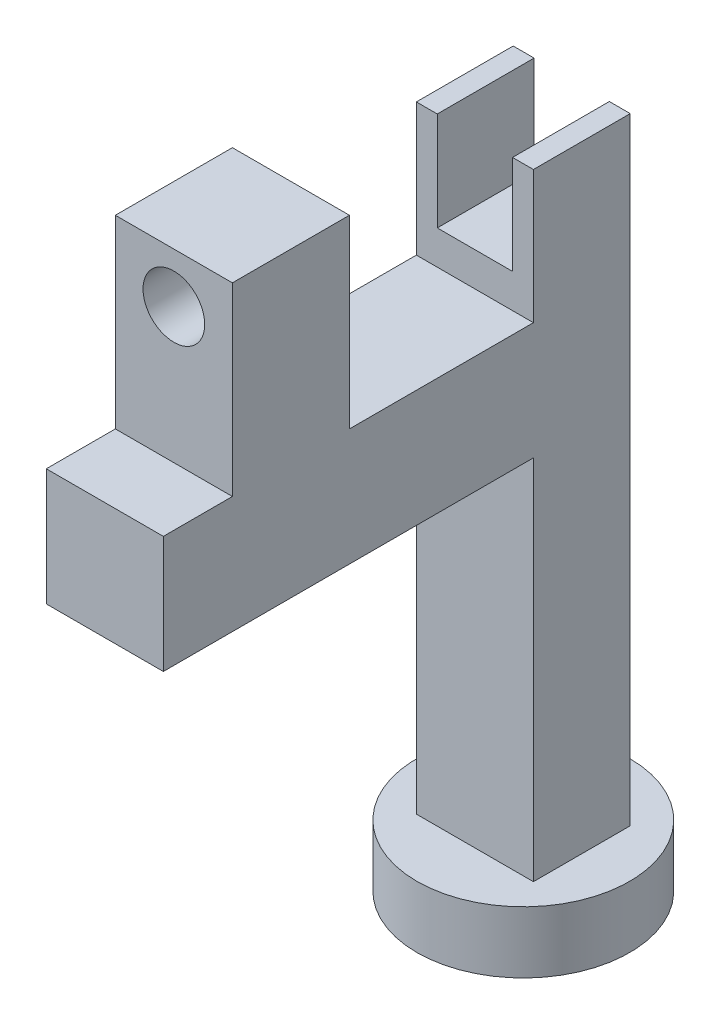
ISO-10303-21;
HEADER;
FILE_DESCRIPTION(('STEP AP214'),'2;1');
FILE_NAME('part.step','',(''),(''),'','','');
FILE_SCHEMA(('AUTOMOTIVE_DESIGN { 1 0 10303 214 1 1 1 1 }'));
ENDSEC;
DATA;
#1=APPLICATION_CONTEXT('core data for automotive mechanical design processes');
#2=APPLICATION_PROTOCOL_DEFINITION('international standard','automotive_design',2000,#1);
#3=PRODUCT_CONTEXT('',#1,'mechanical');
#4=PRODUCT('Part','Part','',(#3));
#5=PRODUCT_RELATED_PRODUCT_CATEGORY('part','',(#4));
#6=PRODUCT_DEFINITION_FORMATION('','',#4);
#7=PRODUCT_DEFINITION_CONTEXT('part definition',#1,'design');
#8=PRODUCT_DEFINITION('design','',#6,#7);
#9=PRODUCT_DEFINITION_SHAPE('','',#8);
#10=(LENGTH_UNIT() NAMED_UNIT(*) SI_UNIT(.MILLI.,.METRE.));
#11=(NAMED_UNIT(*) PLANE_ANGLE_UNIT() SI_UNIT($,.RADIAN.));
#12=(NAMED_UNIT(*) SI_UNIT($,.STERADIAN.) SOLID_ANGLE_UNIT());
#13=UNCERTAINTY_MEASURE_WITH_UNIT(LENGTH_MEASURE(1.E-05),#10,'distance_accuracy_value','');
#14=(GEOMETRIC_REPRESENTATION_CONTEXT(3) GLOBAL_UNCERTAINTY_ASSIGNED_CONTEXT((#13)) GLOBAL_UNIT_ASSIGNED_CONTEXT((#10,
#11,#12)) REPRESENTATION_CONTEXT('',''));
#15=CARTESIAN_POINT('',(0.,0.,0.));
#16=DIRECTION('',(0.,0.,1.));
#17=DIRECTION('',(1.,0.,0.));
#18=AXIS2_PLACEMENT_3D('',#15,#16,#17);
#19=CARTESIAN_POINT('',(0.,-21.5111111111111,75.7));
#20=DIRECTION('',(0.,-1.,0.));
#21=DIRECTION('',(1.,0.,0.));
#22=AXIS2_PLACEMENT_3D('',#19,#20,#21);
#23=PLANE('',#22);
#24=DIRECTION('',(1.,0.,0.));
#25=VECTOR('',#24,1.);
#26=CARTESIAN_POINT('',(0.,-21.5111111111111,64.5047607290041));
#27=LINE('',#26,#25);
#28=CARTESIAN_POINT('',(-18.9777777777777,-21.5111111111111,64.5047607290041));
#29=VERTEX_POINT('',#28);
#30=CARTESIAN_POINT('',(0.,-21.5111111111111,64.5047607290041));
#31=VERTEX_POINT('',#30);
#32=EDGE_CURVE('E315',#29,#31,#27,.T.);
#33=ORIENTED_EDGE('',*,*,#32,.F.);
#34=DIRECTION('',(0.,0.,-1.));
#35=VECTOR('',#34,1.);
#36=CARTESIAN_POINT('',(-18.9777777777777,-21.5111111111111,75.7));
#37=LINE('',#36,#35);
#38=CARTESIAN_POINT('',(-18.9777777777777,-21.5111111111111,75.7));
#39=VERTEX_POINT('',#38);
#40=EDGE_CURVE('E172',#39,#29,#37,.T.);
#41=ORIENTED_EDGE('',*,*,#40,.F.);
#42=DIRECTION('',(-1.,0.,0.));
#43=VECTOR('',#42,1.);
#44=CARTESIAN_POINT('',(0.,-21.5111111111111,75.7));
#45=LINE('',#44,#43);
#46=CARTESIAN_POINT('',(0.,-21.5111111111111,75.7));
#47=VERTEX_POINT('',#46);
#48=EDGE_CURVE('E189',#47,#39,#45,.T.);
#49=ORIENTED_EDGE('',*,*,#48,.F.);
#50=DIRECTION('',(0.,0.,-1.));
#51=VECTOR('',#50,1.);
#52=CARTESIAN_POINT('',(0.,-21.5111111111111,75.7));
#53=LINE('',#52,#51);
#54=EDGE_CURVE('E56',#47,#31,#53,.T.);
#55=ORIENTED_EDGE('',*,*,#54,.T.);
#56=EDGE_LOOP('',(#33,#41,#49,#55));
#57=FACE_BOUND('',#56,.T.);
#58=ADVANCED_FACE('F33',(#57),#23,.F.);
#59=DIRECTION('',(-1.,0.,0.));
#60=VECTOR('',#59,1.);
#61=CARTESIAN_POINT('',(0.,-21.5111111111111,45.5269829512264));
#62=LINE('',#61,#60);
#63=CARTESIAN_POINT('',(0.,-21.5111111111111,45.5269829512264));
#64=VERTEX_POINT('',#63);
#65=CARTESIAN_POINT('',(-18.9777777777777,-21.5111111111111,45.5269829512264));
#66=VERTEX_POINT('',#65);
#67=EDGE_CURVE('E48',#64,#66,#62,.T.);
#68=ORIENTED_EDGE('',*,*,#67,.F.);
#69=CARTESIAN_POINT('',(0.,-21.5111111111111,15.7));
#70=VERTEX_POINT('',#69);
#71=EDGE_CURVE('E195',#64,#70,#53,.T.);
#72=ORIENTED_EDGE('',*,*,#71,.T.);
#73=DIRECTION('',(-1.,0.,0.));
#74=VECTOR('',#73,1.);
#75=CARTESIAN_POINT('',(0.,-21.5111111111111,15.7));
#76=LINE('',#75,#74);
#77=CARTESIAN_POINT('',(-18.9777777777777,-21.5111111111111,15.7));
#78=VERTEX_POINT('',#77);
#79=EDGE_CURVE('E176',#70,#78,#76,.T.);
#80=ORIENTED_EDGE('',*,*,#79,.T.);
#81=EDGE_CURVE('E190',#66,#78,#37,.T.);
#82=ORIENTED_EDGE('',*,*,#81,.F.);
#83=EDGE_LOOP('',(#68,#72,#80,#82));
#84=FACE_BOUND('',#83,.T.);
#85=ADVANCED_FACE('F310',(#84),#23,.F.);
#86=CARTESIAN_POINT('',(0.,0.,15.7));
#87=DIRECTION('',(0.,0.,-1.));
#88=DIRECTION('',(-1.,0.,0.));
#89=AXIS2_PLACEMENT_3D('',#86,#87,#88);
#90=PLANE('',#89);
#91=DIRECTION('',(1.,0.,0.));
#92=VECTOR('',#91,1.);
#93=CARTESIAN_POINT('',(0.,-40.4888888888889,15.7));
#94=LINE('',#93,#92);
#95=CARTESIAN_POINT('',(-18.9777777777777,-40.4888888888889,15.7));
#96=VERTEX_POINT('',#95);
#97=CARTESIAN_POINT('',(0.,-40.4888888888889,15.7));
#98=VERTEX_POINT('',#97);
#99=EDGE_CURVE('E173',#96,#98,#94,.T.);
#100=ORIENTED_EDGE('',*,*,#99,.F.);
#101=DIRECTION('',(0.,-1.,0.));
#102=VECTOR('',#101,1.);
#103=CARTESIAN_POINT('',(-18.9777777777777,-100.,15.7));
#104=LINE('',#103,#102);
#105=CARTESIAN_POINT('',(-18.9777777777777,-100.,15.7));
#106=VERTEX_POINT('',#105);
#107=EDGE_CURVE('E228',#96,#106,#104,.T.);
#108=ORIENTED_EDGE('',*,*,#107,.T.);
#109=DIRECTION('',(1.,0.,0.));
#110=VECTOR('',#109,1.);
#111=CARTESIAN_POINT('',(0.,-100.,15.7));
#112=LINE('',#111,#110);
#113=CARTESIAN_POINT('',(0.,-100.,15.7));
#114=VERTEX_POINT('',#113);
#115=EDGE_CURVE('E232',#106,#114,#112,.T.);
#116=ORIENTED_EDGE('',*,*,#115,.T.);
#117=DIRECTION('',(0.,1.,0.));
#118=VECTOR('',#117,1.);
#119=CARTESIAN_POINT('',(0.,0.,15.7));
#120=LINE('',#119,#118);
#121=EDGE_CURVE('E235',#114,#98,#120,.T.);
#122=ORIENTED_EDGE('',*,*,#121,.T.);
#123=EDGE_LOOP('',(#100,#108,#116,#122));
#124=FACE_BOUND('',#123,.T.);
#125=ADVANCED_FACE('F348',(#124),#90,.F.);
#126=ORIENTED_EDGE('',*,*,#79,.F.);
#127=CARTESIAN_POINT('',(0.,0.,15.7));
#128=VERTEX_POINT('',#127);
#129=EDGE_CURVE('E234',#70,#128,#120,.T.);
#130=ORIENTED_EDGE('',*,*,#129,.T.);
#131=DIRECTION('',(-1.,0.,0.));
#132=VECTOR('',#131,1.);
#133=CARTESIAN_POINT('',(-3.38888888888887,0.,15.7));
#134=LINE('',#133,#132);
#135=CARTESIAN_POINT('',(-3.38888888888887,0.,15.7));
#136=VERTEX_POINT('',#135);
#137=EDGE_CURVE('E216',#128,#136,#134,.T.);
#138=ORIENTED_EDGE('',*,*,#137,.T.);
#139=DIRECTION('',(0.,-1.,0.));
#140=VECTOR('',#139,1.);
#141=CARTESIAN_POINT('',(-3.38888888888887,-16.,15.7));
#142=LINE('',#141,#140);
#143=CARTESIAN_POINT('',(-3.38888888888887,-16.,15.7));
#144=VERTEX_POINT('',#143);
#145=EDGE_CURVE('E219',#136,#144,#142,.T.);
#146=ORIENTED_EDGE('',*,*,#145,.T.);
#147=DIRECTION('',(-1.,0.,0.));
#148=VECTOR('',#147,1.);
#149=CARTESIAN_POINT('',(-15.5888888888889,-16.,15.7));
#150=LINE('',#149,#148);
#151=CARTESIAN_POINT('',(-15.5888888888889,-16.,15.7));
#152=VERTEX_POINT('',#151);
#153=EDGE_CURVE('E222',#144,#152,#150,.T.);
#154=ORIENTED_EDGE('',*,*,#153,.T.);
#155=DIRECTION('',(0.,1.,0.));
#156=VECTOR('',#155,1.);
#157=CARTESIAN_POINT('',(-15.5888888888889,0.,15.7));
#158=LINE('',#157,#156);
#159=CARTESIAN_POINT('',(-15.5888888888889,0.,15.7));
#160=VERTEX_POINT('',#159);
#161=EDGE_CURVE('E224',#152,#160,#158,.T.);
#162=ORIENTED_EDGE('',*,*,#161,.T.);
#163=DIRECTION('',(-1.,0.,0.));
#164=VECTOR('',#163,1.);
#165=CARTESIAN_POINT('',(-18.9777777777777,0.,15.7));
#166=LINE('',#165,#164);
#167=CARTESIAN_POINT('',(-18.9777777777777,0.,15.7));
#168=VERTEX_POINT('',#167);
#169=EDGE_CURVE('E226',#160,#168,#166,.T.);
#170=ORIENTED_EDGE('',*,*,#169,.T.);
#171=EDGE_CURVE('E229',#168,#78,#104,.T.);
#172=ORIENTED_EDGE('',*,*,#171,.T.);
#173=EDGE_LOOP('',(#126,#130,#138,#146,#154,#162,#170,#172));
#174=FACE_BOUND('',#173,.T.);
#175=ADVANCED_FACE('F294',(#174),#90,.F.);
#176=CARTESIAN_POINT('',(-3.38888888888887,0.,15.7));
#177=DIRECTION('',(0.,-1.,0.));
#178=DIRECTION('',(0.,0.,-1.));
#179=AXIS2_PLACEMENT_3D('',#176,#177,#178);
#180=PLANE('',#179);
#181=DIRECTION('',(-1.,0.,0.));
#182=VECTOR('',#181,1.);
#183=CARTESIAN_POINT('',(-3.38888888888887,0.,0.));
#184=LINE('',#183,#182);
#185=CARTESIAN_POINT('',(0.,0.,0.));
#186=VERTEX_POINT('',#185);
#187=CARTESIAN_POINT('',(-3.38888888888887,0.,0.));
#188=VERTEX_POINT('',#187);
#189=EDGE_CURVE('E213',#186,#188,#184,.T.);
#190=ORIENTED_EDGE('',*,*,#189,.T.);
#191=DIRECTION('',(0.,0.,-1.));
#192=VECTOR('',#191,1.);
#193=CARTESIAN_POINT('',(-3.38888888888887,0.,15.7));
#194=LINE('',#193,#192);
#195=EDGE_CURVE('E11',#136,#188,#194,.T.);
#196=ORIENTED_EDGE('',*,*,#195,.F.);
#197=ORIENTED_EDGE('',*,*,#137,.F.);
#198=DIRECTION('',(0.,0.,-1.));
#199=VECTOR('',#198,1.);
#200=CARTESIAN_POINT('',(0.,0.,15.7));
#201=LINE('',#200,#199);
#202=EDGE_CURVE('E237',#128,#186,#201,.T.);
#203=ORIENTED_EDGE('',*,*,#202,.T.);
#204=EDGE_LOOP('',(#190,#196,#197,#203));
#205=FACE_BOUND('',#204,.T.);
#206=ADVANCED_FACE('F35',(#205),#180,.F.);
#207=CARTESIAN_POINT('',(-3.38888888888887,-16.,15.7));
#208=DIRECTION('',(1.,0.,0.));
#209=DIRECTION('',(0.,1.,0.));
#210=AXIS2_PLACEMENT_3D('',#207,#208,#209);
#211=PLANE('',#210);
#212=DIRECTION('',(0.,-1.,0.));
#213=VECTOR('',#212,1.);
#214=CARTESIAN_POINT('',(-3.38888888888887,-16.,0.));
#215=LINE('',#214,#213);
#216=CARTESIAN_POINT('',(-3.38888888888887,-16.,0.));
#217=VERTEX_POINT('',#216);
#218=EDGE_CURVE('E240',#188,#217,#215,.T.);
#219=ORIENTED_EDGE('',*,*,#218,.T.);
#220=DIRECTION('',(0.,0.,-1.));
#221=VECTOR('',#220,1.);
#222=CARTESIAN_POINT('',(-3.38888888888887,-16.,15.7));
#223=LINE('',#222,#221);
#224=EDGE_CURVE('E41',#144,#217,#223,.T.);
#225=ORIENTED_EDGE('',*,*,#224,.F.);
#226=ORIENTED_EDGE('',*,*,#145,.F.);
#227=ORIENTED_EDGE('',*,*,#195,.T.);
#228=EDGE_LOOP('',(#219,#225,#226,#227));
#229=FACE_BOUND('',#228,.T.);
#230=ADVANCED_FACE('F297',(#229),#211,.F.);
#231=CARTESIAN_POINT('',(-15.5888888888889,-16.,15.7));
#232=DIRECTION('',(0.,-1.,0.));
#233=DIRECTION('',(0.,0.,-1.));
#234=AXIS2_PLACEMENT_3D('',#231,#232,#233);
#235=PLANE('',#234);
#236=DIRECTION('',(-1.,0.,0.));
#237=VECTOR('',#236,1.);
#238=CARTESIAN_POINT('',(-15.5888888888889,-16.,0.));
#239=LINE('',#238,#237);
#240=CARTESIAN_POINT('',(-15.5888888888889,-16.,0.));
#241=VERTEX_POINT('',#240);
#242=EDGE_CURVE('E242',#217,#241,#239,.T.);
#243=ORIENTED_EDGE('',*,*,#242,.T.);
#244=DIRECTION('',(0.,0.,-1.));
#245=VECTOR('',#244,1.);
#246=CARTESIAN_POINT('',(-15.5888888888889,-16.,15.7));
#247=LINE('',#246,#245);
#248=EDGE_CURVE('E267',#152,#241,#247,.T.);
#249=ORIENTED_EDGE('',*,*,#248,.F.);
#250=ORIENTED_EDGE('',*,*,#153,.F.);
#251=ORIENTED_EDGE('',*,*,#224,.T.);
#252=EDGE_LOOP('',(#243,#249,#250,#251));
#253=FACE_BOUND('',#252,.T.);
#254=ADVANCED_FACE('F274',(#253),#235,.F.);
#255=CARTESIAN_POINT('',(-15.5888888888889,0.,15.7));
#256=DIRECTION('',(-1.,0.,0.));
#257=DIRECTION('',(0.,0.,1.));
#258=AXIS2_PLACEMENT_3D('',#255,#256,#257);
#259=PLANE('',#258);
#260=DIRECTION('',(0.,1.,0.));
#261=VECTOR('',#260,1.);
#262=CARTESIAN_POINT('',(-15.5888888888889,0.,0.));
#263=LINE('',#262,#261);
#264=CARTESIAN_POINT('',(-15.5888888888889,0.,0.));
#265=VERTEX_POINT('',#264);
#266=EDGE_CURVE('E244',#241,#265,#263,.T.);
#267=ORIENTED_EDGE('',*,*,#266,.T.);
#268=DIRECTION('',(0.,0.,-1.));
#269=VECTOR('',#268,1.);
#270=CARTESIAN_POINT('',(-15.5888888888889,0.,15.7));
#271=LINE('',#270,#269);
#272=EDGE_CURVE('E264',#160,#265,#271,.T.);
#273=ORIENTED_EDGE('',*,*,#272,.F.);
#274=ORIENTED_EDGE('',*,*,#161,.F.);
#275=ORIENTED_EDGE('',*,*,#248,.T.);
#276=EDGE_LOOP('',(#267,#273,#274,#275));
#277=FACE_BOUND('',#276,.T.);
#278=ADVANCED_FACE('F285',(#277),#259,.F.);
#279=CARTESIAN_POINT('',(-18.9777777777777,0.,15.7));
#280=DIRECTION('',(0.,-1.,0.));
#281=DIRECTION('',(0.,0.,-1.));
#282=AXIS2_PLACEMENT_3D('',#279,#280,#281);
#283=PLANE('',#282);
#284=DIRECTION('',(-1.,0.,0.));
#285=VECTOR('',#284,1.);
#286=CARTESIAN_POINT('',(-18.9777777777777,0.,0.));
#287=LINE('',#286,#285);
#288=CARTESIAN_POINT('',(-18.9777777777777,0.,0.));
#289=VERTEX_POINT('',#288);
#290=EDGE_CURVE('E246',#265,#289,#287,.T.);
#291=ORIENTED_EDGE('',*,*,#290,.T.);
#292=DIRECTION('',(0.,0.,-1.));
#293=VECTOR('',#292,1.);
#294=CARTESIAN_POINT('',(-18.9777777777777,0.,15.7));
#295=LINE('',#294,#293);
#296=EDGE_CURVE('E261',#168,#289,#295,.T.);
#297=ORIENTED_EDGE('',*,*,#296,.F.);
#298=ORIENTED_EDGE('',*,*,#169,.F.);
#299=ORIENTED_EDGE('',*,*,#272,.T.);
#300=EDGE_LOOP('',(#291,#297,#298,#299));
#301=FACE_BOUND('',#300,.T.);
#302=ADVANCED_FACE('F289',(#301),#283,.F.);
#303=CARTESIAN_POINT('',(-18.9777777777777,-100.,15.7));
#304=DIRECTION('',(1.,0.,0.));
#305=DIRECTION('',(0.,0.,-1.));
#306=AXIS2_PLACEMENT_3D('',#303,#304,#305);
#307=PLANE('',#306);
#308=DIRECTION('',(0.,-1.,0.));
#309=VECTOR('',#308,1.);
#310=CARTESIAN_POINT('',(-18.9777777777777,-100.,0.));
#311=LINE('',#310,#309);
#312=CARTESIAN_POINT('',(-18.9777777777777,-100.,0.));
#313=VERTEX_POINT('',#312);
#314=EDGE_CURVE('E248',#289,#313,#311,.T.);
#315=ORIENTED_EDGE('',*,*,#314,.T.);
#316=DIRECTION('',(0.,0.,-1.));
#317=VECTOR('',#316,1.);
#318=CARTESIAN_POINT('',(-18.9777777777777,-100.,15.7));
#319=LINE('',#318,#317);
#320=EDGE_CURVE('E258',#106,#313,#319,.T.);
#321=ORIENTED_EDGE('',*,*,#320,.F.);
#322=ORIENTED_EDGE('',*,*,#107,.F.);
#323=DIRECTION('',(0.,0.,-1.));
#324=VECTOR('',#323,1.);
#325=CARTESIAN_POINT('',(-18.9777777777777,-40.4888888888889,75.7));
#326=LINE('',#325,#324);
#327=CARTESIAN_POINT('',(-18.9777777777777,-40.4888888888889,75.7));
#328=VERTEX_POINT('',#327);
#329=EDGE_CURVE('E200',#328,#96,#326,.T.);
#330=ORIENTED_EDGE('',*,*,#329,.F.);
#331=DIRECTION('',(0.,-1.,0.));
#332=VECTOR('',#331,1.);
#333=CARTESIAN_POINT('',(-18.9777777777777,-21.5111111111111,75.7));
#334=LINE('',#333,#332);
#335=EDGE_CURVE('E182',#39,#328,#334,.T.);
#336=ORIENTED_EDGE('',*,*,#335,.F.);
#337=ORIENTED_EDGE('',*,*,#40,.T.);
#338=DIRECTION('',(0.,-1.,0.));
#339=VECTOR('',#338,1.);
#340=CARTESIAN_POINT('',(-18.9777777777777,8.48888888888887,64.5047607290041));
#341=LINE('',#340,#339);
#342=CARTESIAN_POINT('',(-18.9777777777777,8.48888888888887,64.5047607290041));
#343=VERTEX_POINT('',#342);
#344=EDGE_CURVE('E151',#343,#29,#341,.T.);
#345=ORIENTED_EDGE('',*,*,#344,.F.);
#346=DIRECTION('',(0.,0.,1.));
#347=VECTOR('',#346,1.);
#348=CARTESIAN_POINT('',(-18.9777777777777,8.48888888888887,64.5047607290041));
#349=LINE('',#348,#347);
#350=CARTESIAN_POINT('',(-18.9777777777777,8.48888888888887,45.5269829512264));
#351=VERTEX_POINT('',#350);
#352=EDGE_CURVE('E157',#351,#343,#349,.T.);
#353=ORIENTED_EDGE('',*,*,#352,.F.);
#354=DIRECTION('',(0.,-1.,0.));
#355=VECTOR('',#354,1.);
#356=CARTESIAN_POINT('',(-18.9777777777777,8.48888888888887,45.5269829512264));
#357=LINE('',#356,#355);
#358=EDGE_CURVE('E309',#351,#66,#357,.T.);
#359=ORIENTED_EDGE('',*,*,#358,.T.);
#360=ORIENTED_EDGE('',*,*,#81,.T.);
#361=ORIENTED_EDGE('',*,*,#171,.F.);
#362=ORIENTED_EDGE('',*,*,#296,.T.);
#363=EDGE_LOOP('',(#315,#321,#322,#330,#336,#337,#345,#353,#359,#360,#361,#362));
#364=FACE_BOUND('',#363,.T.);
#365=ADVANCED_FACE('F169',(#364),#307,.F.);
#366=CARTESIAN_POINT('',(0.,0.,15.7));
#367=DIRECTION('',(-1.,0.,0.));
#368=DIRECTION('',(0.,-1.,0.));
#369=AXIS2_PLACEMENT_3D('',#366,#367,#368);
#370=PLANE('',#369);
#371=DIRECTION('',(0.,1.,0.));
#372=VECTOR('',#371,1.);
#373=CARTESIAN_POINT('',(0.,0.,0.));
#374=LINE('',#373,#372);
#375=CARTESIAN_POINT('',(0.,-100.,0.));
#376=VERTEX_POINT('',#375);
#377=EDGE_CURVE('E220',#376,#186,#374,.T.);
#378=ORIENTED_EDGE('',*,*,#377,.T.);
#379=ORIENTED_EDGE('',*,*,#202,.F.);
#380=ORIENTED_EDGE('',*,*,#129,.F.);
#381=ORIENTED_EDGE('',*,*,#71,.F.);
#382=DIRECTION('',(0.,-1.,0.));
#383=VECTOR('',#382,1.);
#384=CARTESIAN_POINT('',(0.,8.48888888888887,45.5269829512264));
#385=LINE('',#384,#383);
#386=CARTESIAN_POINT('',(0.,8.48888888888887,45.5269829512264));
#387=VERTEX_POINT('',#386);
#388=EDGE_CURVE('E178',#387,#64,#385,.T.);
#389=ORIENTED_EDGE('',*,*,#388,.F.);
#390=DIRECTION('',(0.,0.,-1.));
#391=VECTOR('',#390,1.);
#392=CARTESIAN_POINT('',(0.,8.48888888888887,64.5047607290041));
#393=LINE('',#392,#391);
#394=CARTESIAN_POINT('',(0.,8.48888888888887,64.5047607290041));
#395=VERTEX_POINT('',#394);
#396=EDGE_CURVE('E156',#395,#387,#393,.T.);
#397=ORIENTED_EDGE('',*,*,#396,.F.);
#398=DIRECTION('',(0.,-1.,0.));
#399=VECTOR('',#398,1.);
#400=CARTESIAN_POINT('',(0.,8.48888888888887,64.5047607290041));
#401=LINE('',#400,#399);
#402=EDGE_CURVE('E153',#395,#31,#401,.T.);
#403=ORIENTED_EDGE('',*,*,#402,.T.);
#404=ORIENTED_EDGE('',*,*,#54,.F.);
#405=DIRECTION('',(0.,1.,0.));
#406=VECTOR('',#405,1.);
#407=CARTESIAN_POINT('',(0.,-21.5111111111111,75.7));
#408=LINE('',#407,#406);
#409=CARTESIAN_POINT('',(0.,-40.4888888888889,75.7));
#410=VERTEX_POINT('',#409);
#411=EDGE_CURVE('E187',#410,#47,#408,.T.);
#412=ORIENTED_EDGE('',*,*,#411,.F.);
#413=DIRECTION('',(0.,0.,-1.));
#414=VECTOR('',#413,1.);
#415=CARTESIAN_POINT('',(0.,-40.4888888888889,75.7));
#416=LINE('',#415,#414);
#417=EDGE_CURVE('E197',#410,#98,#416,.T.);
#418=ORIENTED_EDGE('',*,*,#417,.T.);
#419=ORIENTED_EDGE('',*,*,#121,.F.);
#420=DIRECTION('',(0.,0.,-1.));
#421=VECTOR('',#420,1.);
#422=CARTESIAN_POINT('',(0.,-100.,15.7));
#423=LINE('',#422,#421);
#424=EDGE_CURVE('E256',#114,#376,#423,.T.);
#425=ORIENTED_EDGE('',*,*,#424,.T.);
#426=EDGE_LOOP('',(#378,#379,#380,#381,#389,#397,#403,#404,#412,#418,#419,#425));
#427=FACE_BOUND('',#426,.T.);
#428=ADVANCED_FACE('F379',(#427),#370,.F.);
#429=CARTESIAN_POINT('',(0.,0.,0.));
#430=DIRECTION('',(0.,0.,-1.));
#431=DIRECTION('',(-1.,0.,0.));
#432=AXIS2_PLACEMENT_3D('',#429,#430,#431);
#433=PLANE('',#432);
#434=ORIENTED_EDGE('',*,*,#189,.F.);
#435=ORIENTED_EDGE('',*,*,#377,.F.);
#436=DIRECTION('',(1.,0.,0.));
#437=VECTOR('',#436,1.);
#438=CARTESIAN_POINT('',(0.,-100.,0.));
#439=LINE('',#438,#437);
#440=EDGE_CURVE('E250',#313,#376,#439,.T.);
#441=ORIENTED_EDGE('',*,*,#440,.F.);
#442=ORIENTED_EDGE('',*,*,#314,.F.);
#443=ORIENTED_EDGE('',*,*,#290,.F.);
#444=ORIENTED_EDGE('',*,*,#266,.F.);
#445=ORIENTED_EDGE('',*,*,#242,.F.);
#446=ORIENTED_EDGE('',*,*,#218,.F.);
#447=EDGE_LOOP('',(#434,#435,#441,#442,#443,#444,#445,#446));
#448=FACE_BOUND('',#447,.T.);
#449=ADVANCED_FACE('F280',(#448),#433,.T.);
#450=CARTESIAN_POINT('',(-9.48888888888886,-100.,7.85));
#451=DIRECTION('',(0.,-1.,0.));
#452=DIRECTION('',(0.,0.,-1.));
#453=AXIS2_PLACEMENT_3D('',#450,#451,#452);
#454=PLANE('',#453);
#455=CARTESIAN_POINT('',(-9.48888888888886,-100.,7.85));
#456=DIRECTION('',(0.,-1.,0.));
#457=DIRECTION('',(0.,0.,-1.));
#458=AXIS2_PLACEMENT_3D('',#455,#456,#457);
#459=CIRCLE('',#458,17.25);
#460=CARTESIAN_POINT('',(-9.48888888888886,-100.,-9.4));
#461=VERTEX_POINT('',#460);
#462=EDGE_CURVE('E207',#461,#461,#459,.T.);
#463=ORIENTED_EDGE('',*,*,#462,.F.);
#464=EDGE_LOOP('',(#463));
#465=FACE_BOUND('',#464,.T.);
#466=ORIENTED_EDGE('',*,*,#320,.T.);
#467=ORIENTED_EDGE('',*,*,#440,.T.);
#468=ORIENTED_EDGE('',*,*,#424,.F.);
#469=ORIENTED_EDGE('',*,*,#115,.F.);
#470=EDGE_LOOP('',(#466,#467,#468,#469));
#471=FACE_BOUND('',#470,.T.);
#472=ADVANCED_FACE('F304',(#465,#471),#454,.F.);
#473=CARTESIAN_POINT('',(-9.48888888888886,-110.,7.85));
#474=DIRECTION('',(0.,1.,0.));
#475=DIRECTION('',(0.,0.,1.));
#476=AXIS2_PLACEMENT_3D('',#473,#474,#475);
#477=CYLINDRICAL_SURFACE('',#476,17.25);
#478=CARTESIAN_POINT('',(-9.48888888888886,-110.,7.85));
#479=DIRECTION('',(0.,-1.,0.));
#480=DIRECTION('',(0.,0.,-1.));
#481=AXIS2_PLACEMENT_3D('',#478,#479,#480);
#482=CIRCLE('',#481,17.25);
#483=CARTESIAN_POINT('',(-9.48888888888886,-110.,-9.4));
#484=VERTEX_POINT('',#483);
#485=EDGE_CURVE('E210',#484,#484,#482,.T.);
#486=ORIENTED_EDGE('',*,*,#485,.F.);
#487=EDGE_LOOP('',(#486));
#488=FACE_BOUND('',#487,.T.);
#489=ORIENTED_EDGE('',*,*,#462,.T.);
#490=EDGE_LOOP('',(#489));
#491=FACE_BOUND('',#490,.T.);
#492=ADVANCED_FACE('F366',(#488,#491),#477,.T.);
#493=CARTESIAN_POINT('',(-9.48888888888886,-110.,7.85));
#494=DIRECTION('',(0.,-1.,0.));
#495=DIRECTION('',(0.,0.,-1.));
#496=AXIS2_PLACEMENT_3D('',#493,#494,#495);
#497=PLANE('',#496);
#498=CARTESIAN_POINT('',(-9.48888888888886,-110.,7.85));
#499=DIRECTION('',(0.,-1.,0.));
#500=DIRECTION('',(0.,0.,-1.));
#501=AXIS2_PLACEMENT_3D('',#498,#499,#500);
#502=CIRCLE('',#501,0.800000000000001);
#503=CARTESIAN_POINT('',(-9.48888888888886,-110.,7.05));
#504=VERTEX_POINT('',#503);
#505=EDGE_CURVE('E203',#504,#504,#502,.T.);
#506=ORIENTED_EDGE('',*,*,#505,.F.);
#507=EDGE_LOOP('',(#506));
#508=FACE_BOUND('',#507,.T.);
#509=ORIENTED_EDGE('',*,*,#485,.T.);
#510=EDGE_LOOP('',(#509));
#511=FACE_BOUND('',#510,.T.);
#512=ADVANCED_FACE('F362',(#508,#511),#497,.T.);
#513=CARTESIAN_POINT('',(-9.48888888888886,-108.,7.85));
#514=DIRECTION('',(0.,-1.,0.));
#515=DIRECTION('',(0.,0.,-1.));
#516=AXIS2_PLACEMENT_3D('',#513,#514,#515);
#517=CYLINDRICAL_SURFACE('',#516,0.800000000000001);
#518=CARTESIAN_POINT('',(-9.48888888888886,-108.,7.85));
#519=DIRECTION('',(0.,-1.,0.));
#520=DIRECTION('',(0.,0.,-1.));
#521=AXIS2_PLACEMENT_3D('',#518,#519,#520);
#522=CIRCLE('',#521,0.800000000000001);
#523=CARTESIAN_POINT('',(-9.48888888888886,-108.,7.05));
#524=VERTEX_POINT('',#523);
#525=EDGE_CURVE('E204',#524,#524,#522,.T.);
#526=ORIENTED_EDGE('',*,*,#525,.F.);
#527=EDGE_LOOP('',(#526));
#528=FACE_BOUND('',#527,.T.);
#529=ORIENTED_EDGE('',*,*,#505,.T.);
#530=EDGE_LOOP('',(#529));
#531=FACE_BOUND('',#530,.T.);
#532=ADVANCED_FACE('F358',(#528,#531),#517,.F.);
#533=CARTESIAN_POINT('',(-9.48888888888886,-108.,7.85));
#534=DIRECTION('',(0.,-1.,0.));
#535=DIRECTION('',(0.,0.,-1.));
#536=AXIS2_PLACEMENT_3D('',#533,#534,#535);
#537=PLANE('',#536);
#538=ORIENTED_EDGE('',*,*,#525,.T.);
#539=EDGE_LOOP('',(#538));
#540=FACE_BOUND('',#539,.T.);
#541=ADVANCED_FACE('F354',(#540),#537,.T.);
#542=CARTESIAN_POINT('',(0.,-40.4888888888889,75.7));
#543=DIRECTION('',(0.,1.,0.));
#544=DIRECTION('',(0.,0.,1.));
#545=AXIS2_PLACEMENT_3D('',#542,#543,#544);
#546=PLANE('',#545);
#547=ORIENTED_EDGE('',*,*,#99,.T.);
#548=ORIENTED_EDGE('',*,*,#417,.F.);
#549=DIRECTION('',(1.,0.,0.));
#550=VECTOR('',#549,1.);
#551=CARTESIAN_POINT('',(0.,-40.4888888888889,75.7));
#552=LINE('',#551,#550);
#553=EDGE_CURVE('E185',#328,#410,#552,.T.);
#554=ORIENTED_EDGE('',*,*,#553,.F.);
#555=ORIENTED_EDGE('',*,*,#329,.T.);
#556=EDGE_LOOP('',(#547,#548,#554,#555));
#557=FACE_BOUND('',#556,.T.);
#558=ADVANCED_FACE('F351',(#557),#546,.F.);
#559=CARTESIAN_POINT('',(0.,0.,75.7));
#560=DIRECTION('',(0.,0.,-1.));
#561=DIRECTION('',(-1.,0.,0.));
#562=AXIS2_PLACEMENT_3D('',#559,#560,#561);
#563=PLANE('',#562);
#564=ORIENTED_EDGE('',*,*,#335,.T.);
#565=ORIENTED_EDGE('',*,*,#553,.T.);
#566=ORIENTED_EDGE('',*,*,#411,.T.);
#567=ORIENTED_EDGE('',*,*,#48,.T.);
#568=EDGE_LOOP('',(#564,#565,#566,#567));
#569=FACE_BOUND('',#568,.T.);
#570=ADVANCED_FACE('F339',(#569),#563,.F.);
#571=CARTESIAN_POINT('',(0.,8.48888888888887,64.5047607290041));
#572=DIRECTION('',(0.,0.,-1.));
#573=DIRECTION('',(-1.,0.,0.));
#574=AXIS2_PLACEMENT_3D('',#571,#572,#573);
#575=PLANE('',#574);
#576=CARTESIAN_POINT('',(-9.48888888888887,0.398888888888869,64.5047607290041));
#577=DIRECTION('',(0.,0.,-1.));
#578=DIRECTION('',(-1.,0.,0.));
#579=AXIS2_PLACEMENT_3D('',#576,#577,#578);
#580=CIRCLE('',#579,5.);
#581=CARTESIAN_POINT('',(-14.4888888888889,0.398888888888869,64.5047607290041));
#582=VERTEX_POINT('',#581);
#583=EDGE_CURVE('E317',#582,#582,#580,.F.);
#584=ORIENTED_EDGE('',*,*,#583,.F.);
#585=EDGE_LOOP('',(#584));
#586=FACE_BOUND('',#585,.T.);
#587=ORIENTED_EDGE('',*,*,#32,.T.);
#588=ORIENTED_EDGE('',*,*,#402,.F.);
#589=DIRECTION('',(1.,0.,0.));
#590=VECTOR('',#589,1.);
#591=CARTESIAN_POINT('',(0.,8.48888888888887,64.5047607290041));
#592=LINE('',#591,#590);
#593=EDGE_CURVE('E147',#343,#395,#592,.T.);
#594=ORIENTED_EDGE('',*,*,#593,.F.);
#595=ORIENTED_EDGE('',*,*,#344,.T.);
#596=EDGE_LOOP('',(#587,#588,#594,#595));
#597=FACE_BOUND('',#596,.T.);
#598=ADVANCED_FACE('F149',(#586,#597),#575,.F.);
#599=CARTESIAN_POINT('',(0.,8.48888888888887,45.5269829512264));
#600=DIRECTION('',(0.,0.,1.));
#601=DIRECTION('',(1.,0.,0.));
#602=AXIS2_PLACEMENT_3D('',#599,#600,#601);
#603=PLANE('',#602);
#604=CARTESIAN_POINT('',(-9.48888888888887,0.398888888888869,45.5269829512264));
#605=DIRECTION('',(0.,0.,-1.));
#606=DIRECTION('',(-1.,0.,0.));
#607=AXIS2_PLACEMENT_3D('',#604,#605,#606);
#608=CIRCLE('',#607,5.);
#609=CARTESIAN_POINT('',(-14.4888888888889,0.398888888888869,45.5269829512264));
#610=VERTEX_POINT('',#609);
#611=EDGE_CURVE('E325',#610,#610,#608,.T.);
#612=ORIENTED_EDGE('',*,*,#611,.F.);
#613=EDGE_LOOP('',(#612));
#614=FACE_BOUND('',#613,.T.);
#615=ORIENTED_EDGE('',*,*,#67,.T.);
#616=ORIENTED_EDGE('',*,*,#358,.F.);
#617=DIRECTION('',(-1.,0.,0.));
#618=VECTOR('',#617,1.);
#619=CARTESIAN_POINT('',(0.,8.48888888888887,45.5269829512264));
#620=LINE('',#619,#618);
#621=EDGE_CURVE('E162',#387,#351,#620,.T.);
#622=ORIENTED_EDGE('',*,*,#621,.F.);
#623=ORIENTED_EDGE('',*,*,#388,.T.);
#624=EDGE_LOOP('',(#615,#616,#622,#623));
#625=FACE_BOUND('',#624,.T.);
#626=ADVANCED_FACE('F313',(#614,#625),#603,.F.);
#627=CARTESIAN_POINT('',(0.,8.48888888888887,0.));
#628=DIRECTION('',(0.,1.,0.));
#629=DIRECTION('',(-1.,0.,0.));
#630=AXIS2_PLACEMENT_3D('',#627,#628,#629);
#631=PLANE('',#630);
#632=ORIENTED_EDGE('',*,*,#352,.T.);
#633=ORIENTED_EDGE('',*,*,#593,.T.);
#634=ORIENTED_EDGE('',*,*,#396,.T.);
#635=ORIENTED_EDGE('',*,*,#621,.T.);
#636=EDGE_LOOP('',(#632,#633,#634,#635));
#637=FACE_BOUND('',#636,.T.);
#638=ADVANCED_FACE('F160',(#637),#631,.T.);
#639=CARTESIAN_POINT('',(-9.48888888888887,0.398888888888869,75.701));
#640=DIRECTION('',(0.,0.,-1.));
#641=DIRECTION('',(-1.,0.,0.));
#642=AXIS2_PLACEMENT_3D('',#639,#640,#641);
#643=CYLINDRICAL_SURFACE('',#642,5.);
#644=ORIENTED_EDGE('',*,*,#611,.T.);
#645=EDGE_LOOP('',(#644));
#646=FACE_BOUND('',#645,.T.);
#647=ORIENTED_EDGE('',*,*,#583,.T.);
#648=EDGE_LOOP('',(#647));
#649=FACE_BOUND('',#648,.T.);
#650=ADVANCED_FACE('F329',(#646,#649),#643,.F.);
#651=CLOSED_SHELL('',(#58,#85,#125,#175,#206,#230,#254,#278,#302,#365,#428,#449,#472,#492,#512,
#532,#541,#558,#570,#598,#626,#638,#650));
#652=MANIFOLD_SOLID_BREP('B2',#651);
#653=ADVANCED_BREP_SHAPE_REPRESENTATION('',(#18,#652),#14);
#654=SHAPE_DEFINITION_REPRESENTATION(#9,#653);
ENDSEC;
END-ISO-10303-21;
